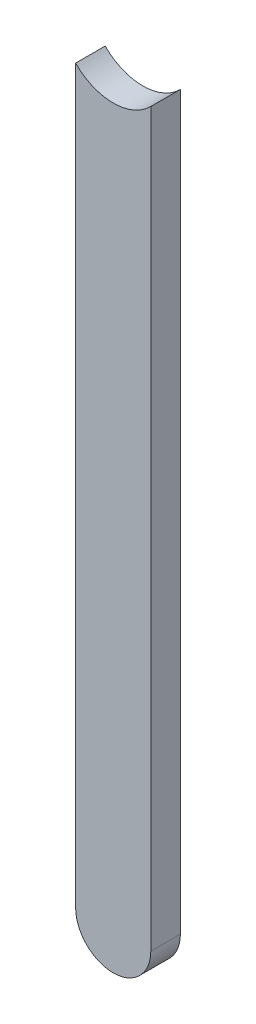
ISO-10303-21;
HEADER;
FILE_DESCRIPTION(('STEP AP214'),'2;1');
FILE_NAME('part.step','',(''),(''),'','','');
FILE_SCHEMA(('AUTOMOTIVE_DESIGN { 1 0 10303 214 1 1 1 1 }'));
ENDSEC;
DATA;
#1=APPLICATION_CONTEXT('core data for automotive mechanical design processes');
#2=APPLICATION_PROTOCOL_DEFINITION('international standard','automotive_design',2000,#1);
#3=PRODUCT_CONTEXT('',#1,'mechanical');
#4=PRODUCT('Part','Part','',(#3));
#5=PRODUCT_RELATED_PRODUCT_CATEGORY('part','',(#4));
#6=PRODUCT_DEFINITION_FORMATION('','',#4);
#7=PRODUCT_DEFINITION_CONTEXT('part definition',#1,'design');
#8=PRODUCT_DEFINITION('design','',#6,#7);
#9=PRODUCT_DEFINITION_SHAPE('','',#8);
#10=(LENGTH_UNIT() NAMED_UNIT(*) SI_UNIT(.MILLI.,.METRE.));
#11=(NAMED_UNIT(*) PLANE_ANGLE_UNIT() SI_UNIT($,.RADIAN.));
#12=(NAMED_UNIT(*) SI_UNIT($,.STERADIAN.) SOLID_ANGLE_UNIT());
#13=UNCERTAINTY_MEASURE_WITH_UNIT(LENGTH_MEASURE(1.E-05),#10,'distance_accuracy_value','');
#14=(GEOMETRIC_REPRESENTATION_CONTEXT(3) GLOBAL_UNCERTAINTY_ASSIGNED_CONTEXT((#13)) GLOBAL_UNIT_ASSIGNED_CONTEXT((#10,
#11,#12)) REPRESENTATION_CONTEXT('',''));
#15=CARTESIAN_POINT('',(0.,0.,0.));
#16=DIRECTION('',(0.,0.,1.));
#17=DIRECTION('',(1.,0.,0.));
#18=AXIS2_PLACEMENT_3D('',#15,#16,#17);
#19=CARTESIAN_POINT('',(138.43,85.73836548,0.));
#20=DIRECTION('',(-1.,0.,0.));
#21=DIRECTION('',(0.,1.,0.));
#22=AXIS2_PLACEMENT_3D('',#19,#20,#21);
#23=PLANE('',#22);
#24=DIRECTION('',(0.,1.,0.));
#25=VECTOR('',#24,1.);
#26=CARTESIAN_POINT('',(138.43,85.73836548,0.1999996));
#27=LINE('',#26,#25);
#28=CARTESIAN_POINT('',(138.43,85.73836548,0.1999996));
#29=VERTEX_POINT('',#28);
#30=CARTESIAN_POINT('',(138.43,90.6831318421333,0.1999996));
#31=VERTEX_POINT('',#30);
#32=EDGE_CURVE('E11',#29,#31,#27,.T.);
#33=ORIENTED_EDGE('',*,*,#32,.F.);
#34=DIRECTION('',(0.,0.,1.));
#35=VECTOR('',#34,1.);
#36=CARTESIAN_POINT('',(138.43,85.73836548,0.));
#37=LINE('',#36,#35);
#38=CARTESIAN_POINT('',(138.43,85.73836548,0.));
#39=VERTEX_POINT('',#38);
#40=EDGE_CURVE('E24',#39,#29,#37,.T.);
#41=ORIENTED_EDGE('',*,*,#40,.F.);
#42=DIRECTION('',(0.,1.,0.));
#43=VECTOR('',#42,1.);
#44=CARTESIAN_POINT('',(138.43,85.73836548,0.));
#45=LINE('',#44,#43);
#46=CARTESIAN_POINT('',(138.43,90.6831318421333,0.));
#47=VERTEX_POINT('',#46);
#48=EDGE_CURVE('E75',#39,#47,#45,.T.);
#49=ORIENTED_EDGE('',*,*,#48,.T.);
#50=DIRECTION('',(0.,0.,1.));
#51=VECTOR('',#50,1.);
#52=CARTESIAN_POINT('',(138.43,90.6831318421333,0.));
#53=LINE('',#52,#51);
#54=EDGE_CURVE('E37',#47,#31,#53,.T.);
#55=ORIENTED_EDGE('',*,*,#54,.T.);
#56=EDGE_LOOP('',(#33,#41,#49,#55));
#57=FACE_BOUND('',#56,.T.);
#58=ADVANCED_FACE('F17',(#57),#23,.F.);
#59=CARTESIAN_POINT('',(138.176,90.932,0.));
#60=DIRECTION('',(0.,0.,-1.));
#61=DIRECTION('',(1.,0.,0.));
#62=AXIS2_PLACEMENT_3D('',#59,#60,#61);
#63=CYLINDRICAL_SURFACE('',#62,0.3556);
#64=DIRECTION('',(0.,0.,1.));
#65=VECTOR('',#64,1.);
#66=CARTESIAN_POINT('',(137.922,90.6831318421332,0.));
#67=LINE('',#66,#65);
#68=CARTESIAN_POINT('',(137.922,90.6831318421332,0.));
#69=VERTEX_POINT('',#68);
#70=CARTESIAN_POINT('',(137.922,90.6831318421332,0.1999996));
#71=VERTEX_POINT('',#70);
#72=EDGE_CURVE('E67',#69,#71,#67,.T.);
#73=ORIENTED_EDGE('',*,*,#72,.T.);
#74=CARTESIAN_POINT('',(138.176,90.932,0.1999996));
#75=DIRECTION('',(0.,0.,1.));
#76=DIRECTION('',(1.,0.,0.));
#77=AXIS2_PLACEMENT_3D('',#74,#75,#76);
#78=CIRCLE('',#77,0.3556);
#79=EDGE_CURVE('E82',#71,#31,#78,.T.);
#80=ORIENTED_EDGE('',*,*,#79,.T.);
#81=ORIENTED_EDGE('',*,*,#54,.F.);
#82=CARTESIAN_POINT('',(138.176,90.932,0.));
#83=DIRECTION('',(0.,0.,1.));
#84=DIRECTION('',(1.,0.,0.));
#85=AXIS2_PLACEMENT_3D('',#82,#83,#84);
#86=CIRCLE('',#85,0.3556);
#87=EDGE_CURVE('E80',#69,#47,#86,.T.);
#88=ORIENTED_EDGE('',*,*,#87,.F.);
#89=EDGE_LOOP('',(#73,#80,#81,#88));
#90=FACE_BOUND('',#89,.T.);
#91=ADVANCED_FACE('F88',(#90),#63,.F.);
#92=CARTESIAN_POINT('',(137.922,90.6831318421332,0.));
#93=DIRECTION('',(1.,0.,0.));
#94=DIRECTION('',(0.,-1.,0.));
#95=AXIS2_PLACEMENT_3D('',#92,#93,#94);
#96=PLANE('',#95);
#97=DIRECTION('',(0.,-1.,0.));
#98=VECTOR('',#97,1.);
#99=CARTESIAN_POINT('',(137.922,90.932,0.1999996));
#100=LINE('',#99,#98);
#101=CARTESIAN_POINT('',(137.922,85.73836548,0.1999996));
#102=VERTEX_POINT('',#101);
#103=EDGE_CURVE('E71',#71,#102,#100,.T.);
#104=ORIENTED_EDGE('',*,*,#103,.F.);
#105=ORIENTED_EDGE('',*,*,#72,.F.);
#106=DIRECTION('',(0.,-1.,0.));
#107=VECTOR('',#106,1.);
#108=CARTESIAN_POINT('',(137.922,90.932,0.));
#109=LINE('',#108,#107);
#110=CARTESIAN_POINT('',(137.922,85.73836548,0.));
#111=VERTEX_POINT('',#110);
#112=EDGE_CURVE('E63',#69,#111,#109,.T.);
#113=ORIENTED_EDGE('',*,*,#112,.T.);
#114=DIRECTION('',(0.,0.,1.));
#115=VECTOR('',#114,1.);
#116=CARTESIAN_POINT('',(137.922,85.73836548,0.));
#117=LINE('',#116,#115);
#118=EDGE_CURVE('E53',#111,#102,#117,.T.);
#119=ORIENTED_EDGE('',*,*,#118,.T.);
#120=EDGE_LOOP('',(#104,#105,#113,#119));
#121=FACE_BOUND('',#120,.T.);
#122=ADVANCED_FACE('F66',(#121),#96,.F.);
#123=CARTESIAN_POINT('',(138.176,85.73836548,0.));
#124=DIRECTION('',(0.,0.,-1.));
#125=DIRECTION('',(-1.,-1.11896493820492E-13,0.));
#126=AXIS2_PLACEMENT_3D('',#123,#124,#125);
#127=CYLINDRICAL_SURFACE('',#126,0.25400000000001);
#128=CARTESIAN_POINT('',(138.176,85.73836548,0.1999996));
#129=DIRECTION('',(0.,0.,1.));
#130=DIRECTION('',(-1.,-1.11896493820492E-13,0.));
#131=AXIS2_PLACEMENT_3D('',#128,#129,#130);
#132=CIRCLE('',#131,0.25400000000001);
#133=EDGE_CURVE('E59',#102,#29,#132,.T.);
#134=ORIENTED_EDGE('',*,*,#133,.F.);
#135=ORIENTED_EDGE('',*,*,#118,.F.);
#136=CARTESIAN_POINT('',(138.176,85.73836548,0.));
#137=DIRECTION('',(0.,0.,1.));
#138=DIRECTION('',(-1.,-1.11896493820492E-13,0.));
#139=AXIS2_PLACEMENT_3D('',#136,#137,#138);
#140=CIRCLE('',#139,0.25400000000001);
#141=EDGE_CURVE('E57',#111,#39,#140,.T.);
#142=ORIENTED_EDGE('',*,*,#141,.T.);
#143=ORIENTED_EDGE('',*,*,#40,.T.);
#144=EDGE_LOOP('',(#134,#135,#142,#143));
#145=FACE_BOUND('',#144,.T.);
#146=ADVANCED_FACE('F55',(#145),#127,.T.);
#147=CARTESIAN_POINT('',(138.43,85.73836548,0.));
#148=DIRECTION('',(0.,0.,-1.));
#149=DIRECTION('',(-1.,0.,0.));
#150=AXIS2_PLACEMENT_3D('',#147,#148,#149);
#151=PLANE('',#150);
#152=ORIENTED_EDGE('',*,*,#48,.F.);
#153=ORIENTED_EDGE('',*,*,#141,.F.);
#154=ORIENTED_EDGE('',*,*,#112,.F.);
#155=ORIENTED_EDGE('',*,*,#87,.T.);
#156=EDGE_LOOP('',(#152,#153,#154,#155));
#157=FACE_BOUND('',#156,.T.);
#158=ADVANCED_FACE('F74',(#157),#151,.T.);
#159=CARTESIAN_POINT('',(138.43,85.73836548,0.1999996));
#160=DIRECTION('',(0.,0.,-1.));
#161=DIRECTION('',(-1.,0.,0.));
#162=AXIS2_PLACEMENT_3D('',#159,#160,#161);
#163=PLANE('',#162);
#164=ORIENTED_EDGE('',*,*,#133,.T.);
#165=ORIENTED_EDGE('',*,*,#32,.T.);
#166=ORIENTED_EDGE('',*,*,#79,.F.);
#167=ORIENTED_EDGE('',*,*,#103,.T.);
#168=EDGE_LOOP('',(#164,#165,#166,#167));
#169=FACE_BOUND('',#168,.T.);
#170=ADVANCED_FACE('F91',(#169),#163,.F.);
#171=CLOSED_SHELL('',(#58,#91,#122,#146,#158,#170));
#172=MANIFOLD_SOLID_BREP('B1',#171);
#173=ADVANCED_BREP_SHAPE_REPRESENTATION('',(#18,#172),#14);
#174=SHAPE_DEFINITION_REPRESENTATION(#9,#173);
ENDSEC;
END-ISO-10303-21;
